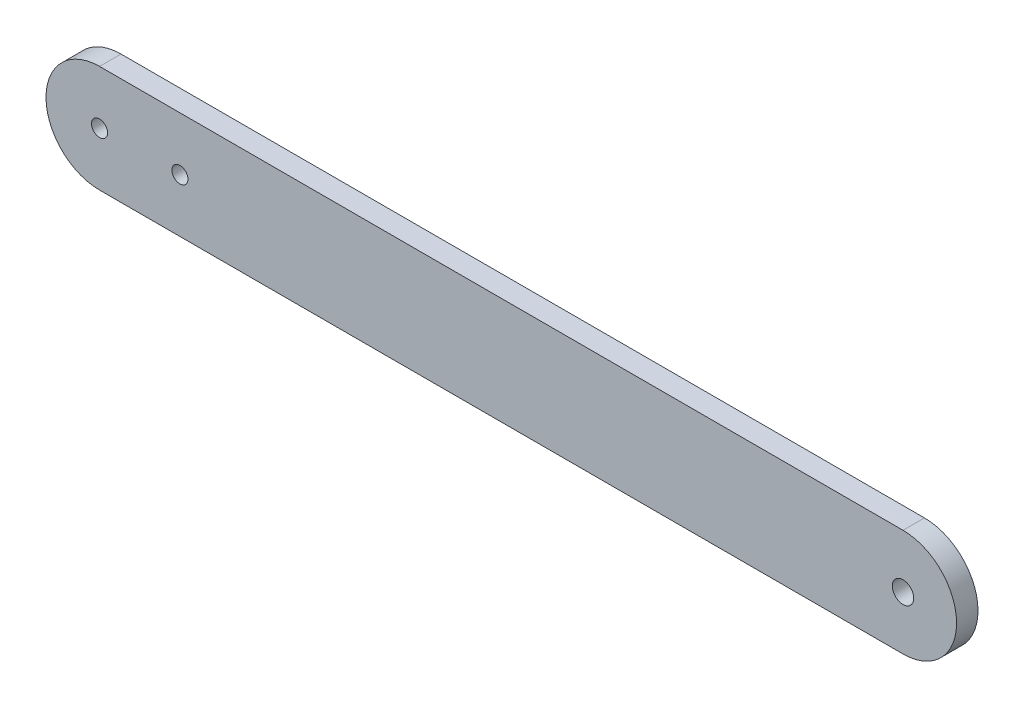
ISO-10303-21;
HEADER;
FILE_DESCRIPTION(('STEP AP214'),'2;1');
FILE_NAME('part.step','',(''),(''),'','','');
FILE_SCHEMA(('AUTOMOTIVE_DESIGN { 1 0 10303 214 1 1 1 1 }'));
ENDSEC;
DATA;
#1=APPLICATION_CONTEXT('core data for automotive mechanical design processes');
#2=APPLICATION_PROTOCOL_DEFINITION('international standard','automotive_design',2000,#1);
#3=PRODUCT_CONTEXT('',#1,'mechanical');
#4=PRODUCT('Part','Part','',(#3));
#5=PRODUCT_RELATED_PRODUCT_CATEGORY('part','',(#4));
#6=PRODUCT_DEFINITION_FORMATION('','',#4);
#7=PRODUCT_DEFINITION_CONTEXT('part definition',#1,'design');
#8=PRODUCT_DEFINITION('design','',#6,#7);
#9=PRODUCT_DEFINITION_SHAPE('','',#8);
#10=(LENGTH_UNIT() NAMED_UNIT(*) SI_UNIT(.MILLI.,.METRE.));
#11=(NAMED_UNIT(*) PLANE_ANGLE_UNIT() SI_UNIT($,.RADIAN.));
#12=(NAMED_UNIT(*) SI_UNIT($,.STERADIAN.) SOLID_ANGLE_UNIT());
#13=UNCERTAINTY_MEASURE_WITH_UNIT(LENGTH_MEASURE(1.E-05),#10,'distance_accuracy_value','');
#14=(GEOMETRIC_REPRESENTATION_CONTEXT(3) GLOBAL_UNCERTAINTY_ASSIGNED_CONTEXT((#13)) GLOBAL_UNIT_ASSIGNED_CONTEXT((#10,
#11,#12)) REPRESENTATION_CONTEXT('',''));
#15=CARTESIAN_POINT('',(0.,0.,0.));
#16=DIRECTION('',(0.,0.,1.));
#17=DIRECTION('',(1.,0.,0.));
#18=AXIS2_PLACEMENT_3D('',#15,#16,#17);
#19=CARTESIAN_POINT('',(-10.,10.,4.));
#20=DIRECTION('',(0.,0.,-1.));
#21=DIRECTION('',(-1.,0.,0.));
#22=AXIS2_PLACEMENT_3D('',#19,#20,#21);
#23=CYLINDRICAL_SURFACE('',#22,10.);
#24=DIRECTION('',(0.,0.,-1.));
#25=VECTOR('',#24,1.);
#26=CARTESIAN_POINT('',(-10.,20.,4.));
#27=LINE('',#26,#25);
#28=CARTESIAN_POINT('',(-10.,20.,4.));
#29=VERTEX_POINT('',#28);
#30=CARTESIAN_POINT('',(-10.,20.,0.));
#31=VERTEX_POINT('',#30);
#32=EDGE_CURVE('E82',#29,#31,#27,.T.);
#33=ORIENTED_EDGE('',*,*,#32,.F.);
#34=CARTESIAN_POINT('',(-10.,10.,4.));
#35=DIRECTION('',(0.,0.,1.));
#36=DIRECTION('',(1.,0.,0.));
#37=AXIS2_PLACEMENT_3D('',#34,#35,#36);
#38=CIRCLE('',#37,10.);
#39=CARTESIAN_POINT('',(-10.,0.,4.));
#40=VERTEX_POINT('',#39);
#41=EDGE_CURVE('E45',#40,#29,#38,.T.);
#42=ORIENTED_EDGE('',*,*,#41,.F.);
#43=DIRECTION('',(0.,0.,-1.));
#44=VECTOR('',#43,1.);
#45=CARTESIAN_POINT('',(-10.,0.,4.));
#46=LINE('',#45,#44);
#47=CARTESIAN_POINT('',(-10.,0.,0.));
#48=VERTEX_POINT('',#47);
#49=EDGE_CURVE('E108',#48,#40,#46,.F.);
#50=ORIENTED_EDGE('',*,*,#49,.F.);
#51=CARTESIAN_POINT('',(-10.,10.,0.));
#52=DIRECTION('',(0.,0.,1.));
#53=DIRECTION('',(1.,0.,0.));
#54=AXIS2_PLACEMENT_3D('',#51,#52,#53);
#55=CIRCLE('',#54,10.);
#56=EDGE_CURVE('E11',#31,#48,#55,.F.);
#57=ORIENTED_EDGE('',*,*,#56,.F.);
#58=EDGE_LOOP('',(#33,#42,#50,#57));
#59=FACE_BOUND('',#58,.T.);
#60=ADVANCED_FACE('F37',(#59),#23,.T.);
#61=CARTESIAN_POINT('',(-160.,9.99999999999998,0.));
#62=DIRECTION('',(0.,0.,-1.));
#63=DIRECTION('',(-1.,0.,0.));
#64=AXIS2_PLACEMENT_3D('',#61,#62,#63);
#65=CYLINDRICAL_SURFACE('',#64,10.);
#66=DIRECTION('',(0.,0.,-1.));
#67=VECTOR('',#66,1.);
#68=CARTESIAN_POINT('',(-160.,20.,4.));
#69=LINE('',#68,#67);
#70=CARTESIAN_POINT('',(-160.,20.,0.));
#71=VERTEX_POINT('',#70);
#72=CARTESIAN_POINT('',(-160.,20.,4.));
#73=VERTEX_POINT('',#72);
#74=EDGE_CURVE('E81',#71,#73,#69,.F.);
#75=ORIENTED_EDGE('',*,*,#74,.F.);
#76=CARTESIAN_POINT('',(-160.,9.99999999999998,0.));
#77=DIRECTION('',(0.,0.,1.));
#78=DIRECTION('',(1.,0.,0.));
#79=AXIS2_PLACEMENT_3D('',#76,#77,#78);
#80=CIRCLE('',#79,10.);
#81=CARTESIAN_POINT('',(-160.,0.,0.));
#82=VERTEX_POINT('',#81);
#83=EDGE_CURVE('E86',#82,#71,#80,.F.);
#84=ORIENTED_EDGE('',*,*,#83,.F.);
#85=DIRECTION('',(0.,0.,-1.));
#86=VECTOR('',#85,1.);
#87=CARTESIAN_POINT('',(-160.,0.,4.));
#88=LINE('',#87,#86);
#89=CARTESIAN_POINT('',(-160.,0.,4.));
#90=VERTEX_POINT('',#89);
#91=EDGE_CURVE('E94',#90,#82,#88,.T.);
#92=ORIENTED_EDGE('',*,*,#91,.F.);
#93=CARTESIAN_POINT('',(-160.,9.99999999999998,4.));
#94=DIRECTION('',(0.,0.,1.));
#95=DIRECTION('',(1.,0.,0.));
#96=AXIS2_PLACEMENT_3D('',#93,#94,#95);
#97=CIRCLE('',#96,10.);
#98=EDGE_CURVE('E93',#73,#90,#97,.T.);
#99=ORIENTED_EDGE('',*,*,#98,.F.);
#100=EDGE_LOOP('',(#75,#84,#92,#99));
#101=FACE_BOUND('',#100,.T.);
#102=ADVANCED_FACE('F97',(#101),#65,.T.);
#103=CARTESIAN_POINT('',(0.,0.,4.));
#104=DIRECTION('',(0.,0.,1.));
#105=DIRECTION('',(1.,0.,0.));
#106=AXIS2_PLACEMENT_3D('',#103,#104,#105);
#107=PLANE('',#106);
#108=CARTESIAN_POINT('',(-10.,10.,4.));
#109=DIRECTION('',(0.,0.,1.));
#110=DIRECTION('',(1.,0.,0.));
#111=AXIS2_PLACEMENT_3D('',#108,#109,#110);
#112=CIRCLE('',#111,2.);
#113=CARTESIAN_POINT('',(-8.,10.,4.));
#114=VERTEX_POINT('',#113);
#115=EDGE_CURVE('E118',#114,#114,#112,.T.);
#116=ORIENTED_EDGE('',*,*,#115,.F.);
#117=EDGE_LOOP('',(#116));
#118=FACE_BOUND('',#117,.T.);
#119=DIRECTION('',(1.,0.,0.));
#120=VECTOR('',#119,1.);
#121=CARTESIAN_POINT('',(0.,0.,4.));
#122=LINE('',#121,#120);
#123=EDGE_CURVE('E98',#90,#40,#122,.T.);
#124=ORIENTED_EDGE('',*,*,#123,.T.);
#125=ORIENTED_EDGE('',*,*,#41,.T.);
#126=DIRECTION('',(-1.,0.,0.));
#127=VECTOR('',#126,1.);
#128=CARTESIAN_POINT('',(0.,20.,4.));
#129=LINE('',#128,#127);
#130=EDGE_CURVE('E102',#29,#73,#129,.T.);
#131=ORIENTED_EDGE('',*,*,#130,.T.);
#132=ORIENTED_EDGE('',*,*,#98,.T.);
#133=EDGE_LOOP('',(#124,#125,#131,#132));
#134=FACE_BOUND('',#133,.T.);
#135=CARTESIAN_POINT('',(-160.,9.99999999999998,4.));
#136=DIRECTION('',(0.,0.,1.));
#137=DIRECTION('',(1.,0.,0.));
#138=AXIS2_PLACEMENT_3D('',#135,#136,#137);
#139=CIRCLE('',#138,1.5);
#140=CARTESIAN_POINT('',(-158.5,9.99999999999998,4.));
#141=VERTEX_POINT('',#140);
#142=EDGE_CURVE('E84',#141,#141,#139,.T.);
#143=ORIENTED_EDGE('',*,*,#142,.F.);
#144=EDGE_LOOP('',(#143));
#145=FACE_BOUND('',#144,.T.);
#146=CARTESIAN_POINT('',(-145.,9.99999999999998,4.));
#147=DIRECTION('',(0.,0.,1.));
#148=DIRECTION('',(1.,0.,0.));
#149=AXIS2_PLACEMENT_3D('',#146,#147,#148);
#150=CIRCLE('',#149,1.5);
#151=CARTESIAN_POINT('',(-143.5,9.99999999999998,4.));
#152=VERTEX_POINT('',#151);
#153=EDGE_CURVE('E124',#152,#152,#150,.T.);
#154=ORIENTED_EDGE('',*,*,#153,.F.);
#155=EDGE_LOOP('',(#154));
#156=FACE_BOUND('',#155,.T.);
#157=ADVANCED_FACE('F110',(#118,#134,#145,#156),#107,.T.);
#158=CARTESIAN_POINT('',(0.,0.,0.));
#159=DIRECTION('',(0.,0.,1.));
#160=DIRECTION('',(1.,0.,0.));
#161=AXIS2_PLACEMENT_3D('',#158,#159,#160);
#162=PLANE('',#161);
#163=DIRECTION('',(-1.,0.,0.));
#164=VECTOR('',#163,1.);
#165=CARTESIAN_POINT('',(0.,20.,0.));
#166=LINE('',#165,#164);
#167=EDGE_CURVE('E76',#31,#71,#166,.T.);
#168=ORIENTED_EDGE('',*,*,#167,.F.);
#169=ORIENTED_EDGE('',*,*,#56,.T.);
#170=DIRECTION('',(1.,0.,0.));
#171=VECTOR('',#170,1.);
#172=CARTESIAN_POINT('',(0.,0.,0.));
#173=LINE('',#172,#171);
#174=EDGE_CURVE('E83',#82,#48,#173,.T.);
#175=ORIENTED_EDGE('',*,*,#174,.F.);
#176=ORIENTED_EDGE('',*,*,#83,.T.);
#177=EDGE_LOOP('',(#168,#169,#175,#176));
#178=FACE_BOUND('',#177,.T.);
#179=CARTESIAN_POINT('',(-160.,9.99999999999998,0.));
#180=DIRECTION('',(0.,0.,1.));
#181=DIRECTION('',(1.,0.,0.));
#182=AXIS2_PLACEMENT_3D('',#179,#180,#181);
#183=CIRCLE('',#182,1.5);
#184=CARTESIAN_POINT('',(-158.5,9.99999999999998,0.));
#185=VERTEX_POINT('',#184);
#186=EDGE_CURVE('E115',#185,#185,#183,.T.);
#187=ORIENTED_EDGE('',*,*,#186,.T.);
#188=EDGE_LOOP('',(#187));
#189=FACE_BOUND('',#188,.T.);
#190=CARTESIAN_POINT('',(-10.,10.,0.));
#191=DIRECTION('',(0.,0.,1.));
#192=DIRECTION('',(1.,0.,0.));
#193=AXIS2_PLACEMENT_3D('',#190,#191,#192);
#194=CIRCLE('',#193,2.);
#195=CARTESIAN_POINT('',(-8.,10.,0.));
#196=VERTEX_POINT('',#195);
#197=EDGE_CURVE('E121',#196,#196,#194,.T.);
#198=ORIENTED_EDGE('',*,*,#197,.T.);
#199=EDGE_LOOP('',(#198));
#200=FACE_BOUND('',#199,.T.);
#201=CARTESIAN_POINT('',(-145.,9.99999999999998,0.));
#202=DIRECTION('',(0.,0.,1.));
#203=DIRECTION('',(1.,0.,0.));
#204=AXIS2_PLACEMENT_3D('',#201,#202,#203);
#205=CIRCLE('',#204,1.5);
#206=CARTESIAN_POINT('',(-143.5,9.99999999999998,0.));
#207=VERTEX_POINT('',#206);
#208=EDGE_CURVE('E127',#207,#207,#205,.T.);
#209=ORIENTED_EDGE('',*,*,#208,.T.);
#210=EDGE_LOOP('',(#209));
#211=FACE_BOUND('',#210,.T.);
#212=ADVANCED_FACE('F87',(#178,#189,#200,#211),#162,.F.);
#213=CARTESIAN_POINT('',(0.,20.,4.));
#214=DIRECTION('',(0.,-1.,0.));
#215=DIRECTION('',(1.,0.,0.));
#216=AXIS2_PLACEMENT_3D('',#213,#214,#215);
#217=PLANE('',#216);
#218=ORIENTED_EDGE('',*,*,#130,.F.);
#219=ORIENTED_EDGE('',*,*,#32,.T.);
#220=ORIENTED_EDGE('',*,*,#167,.T.);
#221=ORIENTED_EDGE('',*,*,#74,.T.);
#222=EDGE_LOOP('',(#218,#219,#220,#221));
#223=FACE_BOUND('',#222,.T.);
#224=ADVANCED_FACE('F79',(#223),#217,.F.);
#225=CARTESIAN_POINT('',(0.,0.,4.));
#226=DIRECTION('',(0.,1.,0.));
#227=DIRECTION('',(-1.,0.,0.));
#228=AXIS2_PLACEMENT_3D('',#225,#226,#227);
#229=PLANE('',#228);
#230=ORIENTED_EDGE('',*,*,#174,.T.);
#231=ORIENTED_EDGE('',*,*,#49,.T.);
#232=ORIENTED_EDGE('',*,*,#123,.F.);
#233=ORIENTED_EDGE('',*,*,#91,.T.);
#234=EDGE_LOOP('',(#230,#231,#232,#233));
#235=FACE_BOUND('',#234,.T.);
#236=ADVANCED_FACE('F180',(#235),#229,.F.);
#237=CARTESIAN_POINT('',(-160.,9.99999999999998,4.));
#238=DIRECTION('',(0.,0.,-1.));
#239=DIRECTION('',(-1.,0.,0.));
#240=AXIS2_PLACEMENT_3D('',#237,#238,#239);
#241=CYLINDRICAL_SURFACE('',#240,1.5);
#242=ORIENTED_EDGE('',*,*,#142,.T.);
#243=EDGE_LOOP('',(#242));
#244=FACE_BOUND('',#243,.T.);
#245=ORIENTED_EDGE('',*,*,#186,.F.);
#246=EDGE_LOOP('',(#245));
#247=FACE_BOUND('',#246,.T.);
#248=ADVANCED_FACE('F171',(#244,#247),#241,.F.);
#249=CARTESIAN_POINT('',(-10.,10.,4.));
#250=DIRECTION('',(0.,0.,-1.));
#251=DIRECTION('',(-1.,0.,0.));
#252=AXIS2_PLACEMENT_3D('',#249,#250,#251);
#253=CYLINDRICAL_SURFACE('',#252,2.);
#254=ORIENTED_EDGE('',*,*,#115,.T.);
#255=EDGE_LOOP('',(#254));
#256=FACE_BOUND('',#255,.T.);
#257=ORIENTED_EDGE('',*,*,#197,.F.);
#258=EDGE_LOOP('',(#257));
#259=FACE_BOUND('',#258,.T.);
#260=ADVANCED_FACE('F162',(#256,#259),#253,.F.);
#261=CARTESIAN_POINT('',(-145.,9.99999999999998,4.));
#262=DIRECTION('',(0.,0.,-1.));
#263=DIRECTION('',(-1.,0.,0.));
#264=AXIS2_PLACEMENT_3D('',#261,#262,#263);
#265=CYLINDRICAL_SURFACE('',#264,1.5);
#266=ORIENTED_EDGE('',*,*,#153,.T.);
#267=EDGE_LOOP('',(#266));
#268=FACE_BOUND('',#267,.T.);
#269=ORIENTED_EDGE('',*,*,#208,.F.);
#270=EDGE_LOOP('',(#269));
#271=FACE_BOUND('',#270,.T.);
#272=ADVANCED_FACE('F133',(#268,#271),#265,.F.);
#273=CLOSED_SHELL('',(#60,#102,#157,#212,#224,#236,#248,#260,#272));
#274=MANIFOLD_SOLID_BREP('B2',#273);
#275=ADVANCED_BREP_SHAPE_REPRESENTATION('',(#18,#274),#14);
#276=SHAPE_DEFINITION_REPRESENTATION(#9,#275);
ENDSEC;
END-ISO-10303-21;
